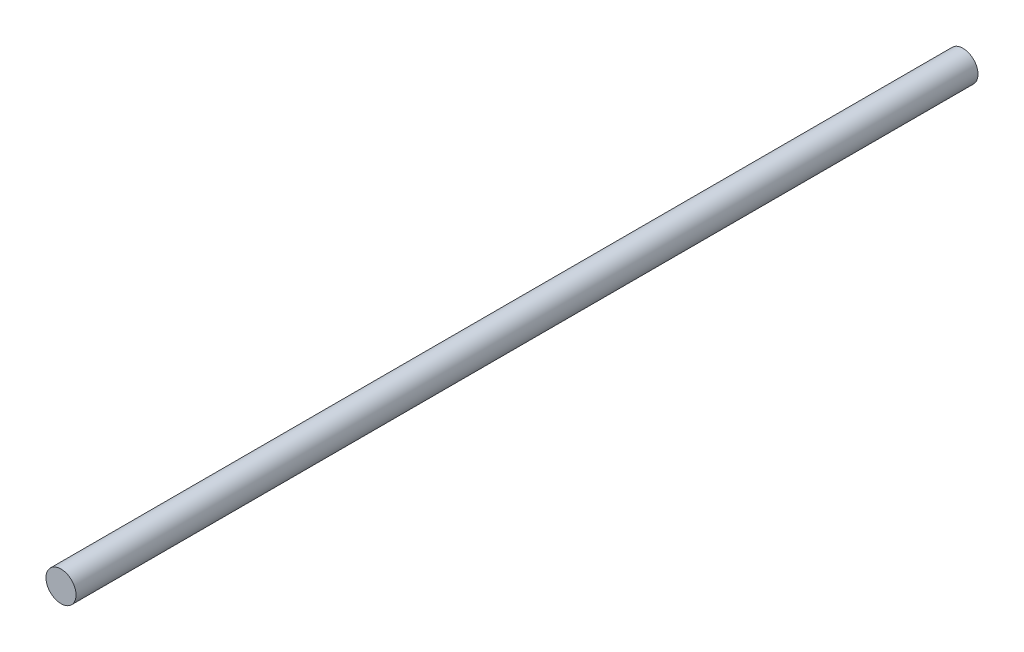
ISO-10303-21;
HEADER;
FILE_DESCRIPTION(('STEP AP214'),'2;1');
FILE_NAME('part.step','',(''),(''),'','','');
FILE_SCHEMA(('AUTOMOTIVE_DESIGN { 1 0 10303 214 1 1 1 1 }'));
ENDSEC;
DATA;
#1=APPLICATION_CONTEXT('core data for automotive mechanical design processes');
#2=APPLICATION_PROTOCOL_DEFINITION('international standard','automotive_design',2000,#1);
#3=PRODUCT_CONTEXT('',#1,'mechanical');
#4=PRODUCT('Part','Part','',(#3));
#5=PRODUCT_RELATED_PRODUCT_CATEGORY('part','',(#4));
#6=PRODUCT_DEFINITION_FORMATION('','',#4);
#7=PRODUCT_DEFINITION_CONTEXT('part definition',#1,'design');
#8=PRODUCT_DEFINITION('design','',#6,#7);
#9=PRODUCT_DEFINITION_SHAPE('','',#8);
#10=(LENGTH_UNIT() NAMED_UNIT(*) SI_UNIT(.MILLI.,.METRE.));
#11=(NAMED_UNIT(*) PLANE_ANGLE_UNIT() SI_UNIT($,.RADIAN.));
#12=(NAMED_UNIT(*) SI_UNIT($,.STERADIAN.) SOLID_ANGLE_UNIT());
#13=UNCERTAINTY_MEASURE_WITH_UNIT(LENGTH_MEASURE(1.E-05),#10,'distance_accuracy_value','');
#14=(GEOMETRIC_REPRESENTATION_CONTEXT(3) GLOBAL_UNCERTAINTY_ASSIGNED_CONTEXT((#13)) GLOBAL_UNIT_ASSIGNED_CONTEXT((#10,
#11,#12)) REPRESENTATION_CONTEXT('',''));
#15=CARTESIAN_POINT('',(0.,0.,0.));
#16=DIRECTION('',(0.,0.,1.));
#17=DIRECTION('',(1.,0.,0.));
#18=AXIS2_PLACEMENT_3D('',#15,#16,#17);
#19=CARTESIAN_POINT('',(0.,0.,723.9));
#20=DIRECTION('',(0.,0.,-1.));
#21=DIRECTION('',(-1.,0.,0.));
#22=AXIS2_PLACEMENT_3D('',#19,#20,#21);
#23=CYLINDRICAL_SURFACE('',#22,12.065);
#24=CARTESIAN_POINT('',(0.,0.,723.9));
#25=DIRECTION('',(0.,0.,1.));
#26=DIRECTION('',(1.,0.,0.));
#27=AXIS2_PLACEMENT_3D('',#24,#25,#26);
#28=CIRCLE('',#27,12.065);
#29=CARTESIAN_POINT('',(12.065,0.,723.9));
#30=VERTEX_POINT('',#29);
#31=EDGE_CURVE('E10',#30,#30,#28,.T.);
#32=ORIENTED_EDGE('',*,*,#31,.F.);
#33=EDGE_LOOP('',(#32));
#34=FACE_BOUND('',#33,.T.);
#35=CARTESIAN_POINT('',(0.,0.,0.));
#36=DIRECTION('',(0.,0.,1.));
#37=DIRECTION('',(1.,0.,0.));
#38=AXIS2_PLACEMENT_3D('',#35,#36,#37);
#39=CIRCLE('',#38,12.065);
#40=CARTESIAN_POINT('',(12.065,0.,0.));
#41=VERTEX_POINT('',#40);
#42=EDGE_CURVE('E35',#41,#41,#39,.T.);
#43=ORIENTED_EDGE('',*,*,#42,.T.);
#44=EDGE_LOOP('',(#43));
#45=FACE_BOUND('',#44,.T.);
#46=ADVANCED_FACE('F32',(#34,#45),#23,.T.);
#47=CARTESIAN_POINT('',(0.,0.,723.9));
#48=DIRECTION('',(0.,0.,1.));
#49=DIRECTION('',(1.,0.,0.));
#50=AXIS2_PLACEMENT_3D('',#47,#48,#49);
#51=PLANE('',#50);
#52=ORIENTED_EDGE('',*,*,#31,.T.);
#53=EDGE_LOOP('',(#52));
#54=FACE_BOUND('',#53,.T.);
#55=ADVANCED_FACE('F47',(#54),#51,.T.);
#56=CARTESIAN_POINT('',(0.,0.,0.));
#57=DIRECTION('',(0.,0.,1.));
#58=DIRECTION('',(1.,0.,0.));
#59=AXIS2_PLACEMENT_3D('',#56,#57,#58);
#60=PLANE('',#59);
#61=ORIENTED_EDGE('',*,*,#42,.F.);
#62=EDGE_LOOP('',(#61));
#63=FACE_BOUND('',#62,.T.);
#64=ADVANCED_FACE('F45',(#63),#60,.F.);
#65=CLOSED_SHELL('',(#46,#55,#64));
#66=MANIFOLD_SOLID_BREP('B2',#65);
#67=ADVANCED_BREP_SHAPE_REPRESENTATION('',(#18,#66),#14);
#68=SHAPE_DEFINITION_REPRESENTATION(#9,#67);
ENDSEC;
END-ISO-10303-21;
